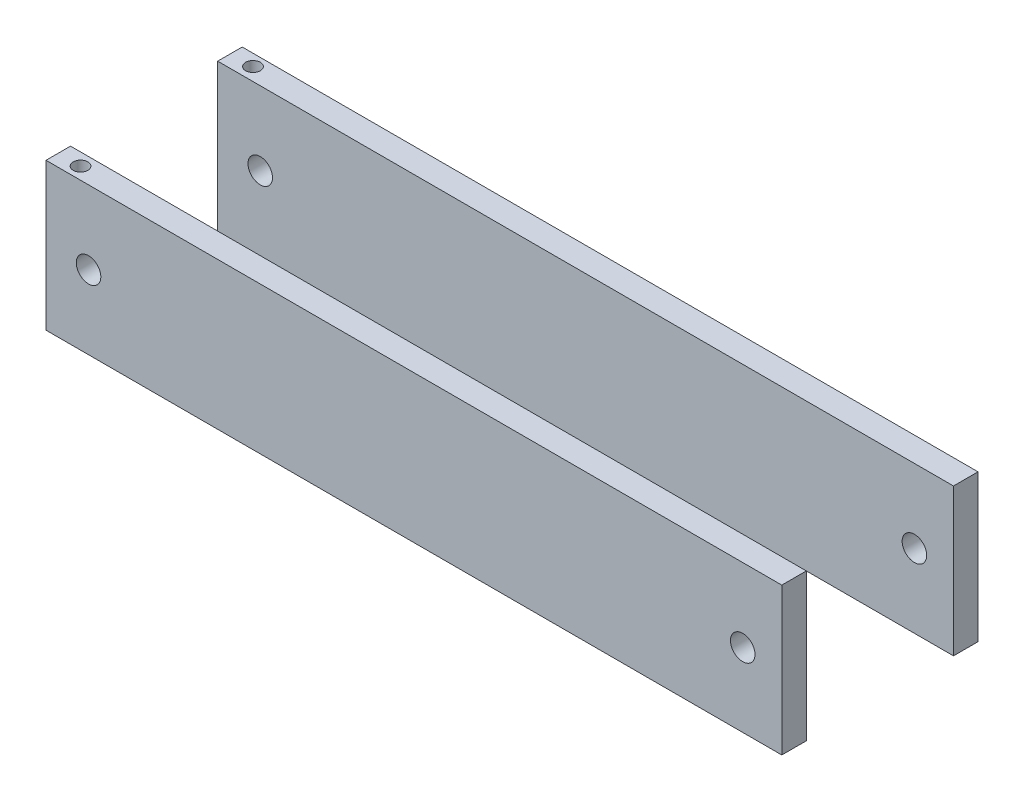
ISO-10303-21;
HEADER;
FILE_DESCRIPTION(('STEP AP214'),'2;1');
FILE_NAME('part.step','',(''),(''),'','','');
FILE_SCHEMA(('AUTOMOTIVE_DESIGN { 1 0 10303 214 1 1 1 1 }'));
ENDSEC;
DATA;
#1=APPLICATION_CONTEXT('core data for automotive mechanical design processes');
#2=APPLICATION_PROTOCOL_DEFINITION('international standard','automotive_design',2000,#1);
#3=PRODUCT_CONTEXT('',#1,'mechanical');
#4=PRODUCT('Part','Part','',(#3));
#5=PRODUCT_RELATED_PRODUCT_CATEGORY('part','',(#4));
#6=PRODUCT_DEFINITION_FORMATION('','',#4);
#7=PRODUCT_DEFINITION_CONTEXT('part definition',#1,'design');
#8=PRODUCT_DEFINITION('design','',#6,#7);
#9=PRODUCT_DEFINITION_SHAPE('','',#8);
#10=(LENGTH_UNIT() NAMED_UNIT(*) SI_UNIT(.MILLI.,.METRE.));
#11=(NAMED_UNIT(*) PLANE_ANGLE_UNIT() SI_UNIT($,.RADIAN.));
#12=(NAMED_UNIT(*) SI_UNIT($,.STERADIAN.) SOLID_ANGLE_UNIT());
#13=UNCERTAINTY_MEASURE_WITH_UNIT(LENGTH_MEASURE(1.E-05),#10,'distance_accuracy_value','');
#14=(GEOMETRIC_REPRESENTATION_CONTEXT(3) GLOBAL_UNCERTAINTY_ASSIGNED_CONTEXT((#13)) GLOBAL_UNIT_ASSIGNED_CONTEXT((#10,
#11,#12)) REPRESENTATION_CONTEXT('',''));
#15=CARTESIAN_POINT('',(0.,0.,0.));
#16=DIRECTION('',(0.,0.,1.));
#17=DIRECTION('',(1.,0.,0.));
#18=AXIS2_PLACEMENT_3D('',#15,#16,#17);
#19=CARTESIAN_POINT('',(-150.,30.,40.));
#20=DIRECTION('',(0.,-1.,0.));
#21=DIRECTION('',(0.,0.,-1.));
#22=AXIS2_PLACEMENT_3D('',#19,#20,#21);
#23=PLANE('',#22);
#24=CARTESIAN_POINT('',(-140.904606352604,30.,35.0126597603438));
#25=DIRECTION('',(0.,1.,0.));
#26=DIRECTION('',(0.,0.,1.));
#27=AXIS2_PLACEMENT_3D('',#24,#25,#26);
#28=CIRCLE('',#27,2.99999999999999);
#29=CARTESIAN_POINT('',(-140.904606352604,30.,38.0126597603438));
#30=VERTEX_POINT('',#29);
#31=EDGE_CURVE('E121',#30,#30,#28,.T.);
#32=ORIENTED_EDGE('',*,*,#31,.F.);
#33=EDGE_LOOP('',(#32));
#34=FACE_BOUND('',#33,.T.);
#35=DIRECTION('',(1.,0.,0.));
#36=VECTOR('',#35,1.);
#37=CARTESIAN_POINT('',(-150.,30.,30.));
#38=LINE('',#37,#36);
#39=CARTESIAN_POINT('',(-150.,30.,30.));
#40=VERTEX_POINT('',#39);
#41=CARTESIAN_POINT('',(150.,30.,30.));
#42=VERTEX_POINT('',#41);
#43=EDGE_CURVE('E56',#40,#42,#38,.T.);
#44=ORIENTED_EDGE('',*,*,#43,.F.);
#45=DIRECTION('',(0.,0.,-1.));
#46=VECTOR('',#45,1.);
#47=CARTESIAN_POINT('',(-150.,30.,40.));
#48=LINE('',#47,#46);
#49=CARTESIAN_POINT('',(-150.,30.,40.));
#50=VERTEX_POINT('',#49);
#51=EDGE_CURVE('E133',#50,#40,#48,.T.);
#52=ORIENTED_EDGE('',*,*,#51,.F.);
#53=DIRECTION('',(-1.,0.,0.));
#54=VECTOR('',#53,1.);
#55=CARTESIAN_POINT('',(-150.,30.,40.));
#56=LINE('',#55,#54);
#57=CARTESIAN_POINT('',(150.,30.,40.));
#58=VERTEX_POINT('',#57);
#59=EDGE_CURVE('E132',#58,#50,#56,.T.);
#60=ORIENTED_EDGE('',*,*,#59,.F.);
#61=DIRECTION('',(0.,0.,-1.));
#62=VECTOR('',#61,1.);
#63=CARTESIAN_POINT('',(150.,30.,40.));
#64=LINE('',#63,#62);
#65=EDGE_CURVE('E111',#58,#42,#64,.T.);
#66=ORIENTED_EDGE('',*,*,#65,.T.);
#67=EDGE_LOOP('',(#44,#52,#60,#66));
#68=FACE_BOUND('',#67,.T.);
#69=ADVANCED_FACE('F47',(#34,#68),#23,.F.);
#70=CARTESIAN_POINT('',(-150.,30.,40.));
#71=DIRECTION('',(1.,0.,0.));
#72=DIRECTION('',(0.,0.,-1.));
#73=AXIS2_PLACEMENT_3D('',#70,#71,#72);
#74=PLANE('',#73);
#75=DIRECTION('',(0.,1.,0.));
#76=VECTOR('',#75,1.);
#77=CARTESIAN_POINT('',(-150.,-30.,30.));
#78=LINE('',#77,#76);
#79=CARTESIAN_POINT('',(-150.,-30.,30.));
#80=VERTEX_POINT('',#79);
#81=EDGE_CURVE('E12',#80,#40,#78,.T.);
#82=ORIENTED_EDGE('',*,*,#81,.F.);
#83=DIRECTION('',(0.,0.,-1.));
#84=VECTOR('',#83,1.);
#85=CARTESIAN_POINT('',(-150.,-30.,40.));
#86=LINE('',#85,#84);
#87=CARTESIAN_POINT('',(-150.,-30.,40.));
#88=VERTEX_POINT('',#87);
#89=EDGE_CURVE('E105',#88,#80,#86,.T.);
#90=ORIENTED_EDGE('',*,*,#89,.F.);
#91=DIRECTION('',(0.,-1.,0.));
#92=VECTOR('',#91,1.);
#93=CARTESIAN_POINT('',(-150.,30.,40.));
#94=LINE('',#93,#92);
#95=EDGE_CURVE('E129',#50,#88,#94,.T.);
#96=ORIENTED_EDGE('',*,*,#95,.F.);
#97=ORIENTED_EDGE('',*,*,#51,.T.);
#98=EDGE_LOOP('',(#82,#90,#96,#97));
#99=FACE_BOUND('',#98,.T.);
#100=ADVANCED_FACE('F138',(#99),#74,.F.);
#101=CARTESIAN_POINT('',(-150.,-30.,40.));
#102=DIRECTION('',(0.,1.,0.));
#103=DIRECTION('',(0.,0.,1.));
#104=AXIS2_PLACEMENT_3D('',#101,#102,#103);
#105=PLANE('',#104);
#106=ORIENTED_EDGE('',*,*,#89,.T.);
#107=DIRECTION('',(1.,0.,0.));
#108=VECTOR('',#107,1.);
#109=CARTESIAN_POINT('',(-150.,-30.,30.));
#110=LINE('',#109,#108);
#111=CARTESIAN_POINT('',(150.,-30.,30.));
#112=VERTEX_POINT('',#111);
#113=EDGE_CURVE('E87',#80,#112,#110,.T.);
#114=ORIENTED_EDGE('',*,*,#113,.T.);
#115=DIRECTION('',(0.,0.,-1.));
#116=VECTOR('',#115,1.);
#117=CARTESIAN_POINT('',(150.,-30.,40.));
#118=LINE('',#117,#116);
#119=CARTESIAN_POINT('',(150.,-30.,40.));
#120=VERTEX_POINT('',#119);
#121=EDGE_CURVE('E91',#120,#112,#118,.T.);
#122=ORIENTED_EDGE('',*,*,#121,.F.);
#123=DIRECTION('',(1.,0.,0.));
#124=VECTOR('',#123,1.);
#125=CARTESIAN_POINT('',(-150.,-30.,40.));
#126=LINE('',#125,#124);
#127=EDGE_CURVE('E130',#88,#120,#126,.T.);
#128=ORIENTED_EDGE('',*,*,#127,.F.);
#129=EDGE_LOOP('',(#106,#114,#122,#128));
#130=FACE_BOUND('',#129,.T.);
#131=ADVANCED_FACE('F98',(#130),#105,.F.);
#132=CARTESIAN_POINT('',(150.,30.,40.));
#133=DIRECTION('',(-1.,0.,0.));
#134=DIRECTION('',(0.,0.,1.));
#135=AXIS2_PLACEMENT_3D('',#132,#133,#134);
#136=PLANE('',#135);
#137=ORIENTED_EDGE('',*,*,#121,.T.);
#138=DIRECTION('',(0.,1.,0.));
#139=VECTOR('',#138,1.);
#140=CARTESIAN_POINT('',(150.,-30.,30.));
#141=LINE('',#140,#139);
#142=EDGE_CURVE('E81',#112,#42,#141,.T.);
#143=ORIENTED_EDGE('',*,*,#142,.T.);
#144=ORIENTED_EDGE('',*,*,#65,.F.);
#145=DIRECTION('',(0.,1.,0.));
#146=VECTOR('',#145,1.);
#147=CARTESIAN_POINT('',(150.,30.,40.));
#148=LINE('',#147,#146);
#149=EDGE_CURVE('E95',#120,#58,#148,.T.);
#150=ORIENTED_EDGE('',*,*,#149,.F.);
#151=EDGE_LOOP('',(#137,#143,#144,#150));
#152=FACE_BOUND('',#151,.T.);
#153=ADVANCED_FACE('F51',(#152),#136,.F.);
#154=CARTESIAN_POINT('',(0.,0.,40.));
#155=DIRECTION('',(0.,0.,1.));
#156=DIRECTION('',(1.,0.,0.));
#157=AXIS2_PLACEMENT_3D('',#154,#155,#156);
#158=PLANE('',#157);
#159=CARTESIAN_POINT('',(134.072867862781,0.,40.));
#160=DIRECTION('',(0.,0.,-1.));
#161=DIRECTION('',(-1.,0.,0.));
#162=AXIS2_PLACEMENT_3D('',#159,#160,#161);
#163=CIRCLE('',#162,5.00000000000002);
#164=CARTESIAN_POINT('',(129.072867862781,0.,40.));
#165=VERTEX_POINT('',#164);
#166=EDGE_CURVE('E109',#165,#165,#163,.T.);
#167=ORIENTED_EDGE('',*,*,#166,.T.);
#168=EDGE_LOOP('',(#167));
#169=FACE_BOUND('',#168,.T.);
#170=CARTESIAN_POINT('',(-132.649589010734,0.,40.));
#171=DIRECTION('',(0.,0.,-1.));
#172=DIRECTION('',(-1.,0.,0.));
#173=AXIS2_PLACEMENT_3D('',#170,#171,#172);
#174=CIRCLE('',#173,4.99999999999999);
#175=CARTESIAN_POINT('',(-137.649589010734,0.,40.));
#176=VERTEX_POINT('',#175);
#177=EDGE_CURVE('E117',#176,#176,#174,.T.);
#178=ORIENTED_EDGE('',*,*,#177,.T.);
#179=EDGE_LOOP('',(#178));
#180=FACE_BOUND('',#179,.T.);
#181=ORIENTED_EDGE('',*,*,#149,.T.);
#182=ORIENTED_EDGE('',*,*,#59,.T.);
#183=ORIENTED_EDGE('',*,*,#95,.T.);
#184=ORIENTED_EDGE('',*,*,#127,.T.);
#185=EDGE_LOOP('',(#181,#182,#183,#184));
#186=FACE_BOUND('',#185,.T.);
#187=ADVANCED_FACE('F141',(#169,#180,#186),#158,.T.);
#188=CARTESIAN_POINT('',(-150.,-30.,30.));
#189=DIRECTION('',(0.,0.,1.));
#190=DIRECTION('',(1.,0.,0.));
#191=AXIS2_PLACEMENT_3D('',#188,#189,#190);
#192=PLANE('',#191);
#193=CARTESIAN_POINT('',(134.072867862781,0.,30.));
#194=DIRECTION('',(0.,0.,1.));
#195=DIRECTION('',(1.,0.,0.));
#196=AXIS2_PLACEMENT_3D('',#193,#194,#195);
#197=CIRCLE('',#196,5.00000000000002);
#198=CARTESIAN_POINT('',(139.072867862781,0.,30.));
#199=VERTEX_POINT('',#198);
#200=EDGE_CURVE('E52',#199,#199,#197,.T.);
#201=ORIENTED_EDGE('',*,*,#200,.T.);
#202=EDGE_LOOP('',(#201));
#203=FACE_BOUND('',#202,.T.);
#204=CARTESIAN_POINT('',(-132.649589010734,0.,30.));
#205=DIRECTION('',(0.,0.,1.));
#206=DIRECTION('',(1.,0.,0.));
#207=AXIS2_PLACEMENT_3D('',#204,#205,#206);
#208=CIRCLE('',#207,4.99999999999999);
#209=CARTESIAN_POINT('',(-127.649589010734,0.,30.));
#210=VERTEX_POINT('',#209);
#211=EDGE_CURVE('E107',#210,#210,#208,.T.);
#212=ORIENTED_EDGE('',*,*,#211,.T.);
#213=EDGE_LOOP('',(#212));
#214=FACE_BOUND('',#213,.T.);
#215=ORIENTED_EDGE('',*,*,#43,.T.);
#216=ORIENTED_EDGE('',*,*,#142,.F.);
#217=ORIENTED_EDGE('',*,*,#113,.F.);
#218=ORIENTED_EDGE('',*,*,#81,.T.);
#219=EDGE_LOOP('',(#215,#216,#217,#218));
#220=FACE_BOUND('',#219,.T.);
#221=ADVANCED_FACE('F88',(#203,#214,#220),#192,.F.);
#222=CARTESIAN_POINT('',(-132.649589010734,0.,40.));
#223=DIRECTION('',(0.,0.,-1.));
#224=DIRECTION('',(-1.,0.,0.));
#225=AXIS2_PLACEMENT_3D('',#222,#223,#224);
#226=CYLINDRICAL_SURFACE('',#225,4.99999999999999);
#227=ORIENTED_EDGE('',*,*,#177,.F.);
#228=EDGE_LOOP('',(#227));
#229=FACE_BOUND('',#228,.T.);
#230=ORIENTED_EDGE('',*,*,#211,.F.);
#231=EDGE_LOOP('',(#230));
#232=FACE_BOUND('',#231,.T.);
#233=ADVANCED_FACE('F147',(#229,#232),#226,.F.);
#234=CARTESIAN_POINT('',(134.072867862781,0.,40.));
#235=DIRECTION('',(0.,0.,-1.));
#236=DIRECTION('',(-1.,0.,0.));
#237=AXIS2_PLACEMENT_3D('',#234,#235,#236);
#238=CYLINDRICAL_SURFACE('',#237,5.00000000000002);
#239=ORIENTED_EDGE('',*,*,#166,.F.);
#240=EDGE_LOOP('',(#239));
#241=FACE_BOUND('',#240,.T.);
#242=ORIENTED_EDGE('',*,*,#200,.F.);
#243=EDGE_LOOP('',(#242));
#244=FACE_BOUND('',#243,.T.);
#245=ADVANCED_FACE('F197',(#241,#244),#238,.F.);
#246=CARTESIAN_POINT('',(-140.904606352604,20.,35.0126597603438));
#247=DIRECTION('',(0.,1.,0.));
#248=DIRECTION('',(0.,0.,1.));
#249=AXIS2_PLACEMENT_3D('',#246,#247,#248);
#250=CYLINDRICAL_SURFACE('',#249,2.99999999999999);
#251=CARTESIAN_POINT('',(-140.904606352604,20.,35.0126597603438));
#252=DIRECTION('',(0.,1.,0.));
#253=DIRECTION('',(0.,0.,1.));
#254=AXIS2_PLACEMENT_3D('',#251,#252,#253);
#255=CIRCLE('',#254,2.99999999999999);
#256=CARTESIAN_POINT('',(-140.904606352604,20.,38.0126597603438));
#257=VERTEX_POINT('',#256);
#258=EDGE_CURVE('E122',#257,#257,#255,.T.);
#259=ORIENTED_EDGE('',*,*,#258,.F.);
#260=EDGE_LOOP('',(#259));
#261=FACE_BOUND('',#260,.T.);
#262=ORIENTED_EDGE('',*,*,#31,.T.);
#263=EDGE_LOOP('',(#262));
#264=FACE_BOUND('',#263,.T.);
#265=ADVANCED_FACE('F202',(#261,#264),#250,.F.);
#266=CARTESIAN_POINT('',(-140.904606352604,20.,35.0126597603438));
#267=DIRECTION('',(0.,1.,0.));
#268=DIRECTION('',(0.,0.,1.));
#269=AXIS2_PLACEMENT_3D('',#266,#267,#268);
#270=PLANE('',#269);
#271=ORIENTED_EDGE('',*,*,#258,.T.);
#272=EDGE_LOOP('',(#271));
#273=FACE_BOUND('',#272,.T.);
#274=ADVANCED_FACE('F212',(#273),#270,.T.);
#275=CLOSED_SHELL('',(#69,#100,#131,#153,#187,#221,#233,#245,#265,#274));
#276=MANIFOLD_SOLID_BREP('B2',#275);
#277=CARTESIAN_POINT('',(0.,0.,-40.));
#278=DIRECTION('',(0.,0.,1.));
#279=DIRECTION('',(1.,0.,0.));
#280=AXIS2_PLACEMENT_3D('',#277,#278,#279);
#281=PLANE('',#280);
#282=CARTESIAN_POINT('',(134.072867862781,0.,-40.));
#283=DIRECTION('',(0.,0.,-1.));
#284=DIRECTION('',(-1.,0.,0.));
#285=AXIS2_PLACEMENT_3D('',#282,#283,#284);
#286=CIRCLE('',#285,5.00000000000002);
#287=CARTESIAN_POINT('',(129.072867862781,0.,-40.));
#288=VERTEX_POINT('',#287);
#289=EDGE_CURVE('E310',#288,#288,#286,.T.);
#290=ORIENTED_EDGE('',*,*,#289,.F.);
#291=EDGE_LOOP('',(#290));
#292=FACE_BOUND('',#291,.T.);
#293=CARTESIAN_POINT('',(-132.649589010734,0.,-40.));
#294=DIRECTION('',(0.,0.,-1.));
#295=DIRECTION('',(-1.,0.,0.));
#296=AXIS2_PLACEMENT_3D('',#293,#294,#295);
#297=CIRCLE('',#296,4.99999999999999);
#298=CARTESIAN_POINT('',(-137.649589010734,0.,-40.));
#299=VERTEX_POINT('',#298);
#300=EDGE_CURVE('E314',#299,#299,#297,.T.);
#301=ORIENTED_EDGE('',*,*,#300,.F.);
#302=EDGE_LOOP('',(#301));
#303=FACE_BOUND('',#302,.T.);
#304=DIRECTION('',(0.,1.,0.));
#305=VECTOR('',#304,1.);
#306=CARTESIAN_POINT('',(150.,30.,-40.));
#307=LINE('',#306,#305);
#308=CARTESIAN_POINT('',(150.,-30.,-40.));
#309=VERTEX_POINT('',#308);
#310=CARTESIAN_POINT('',(150.,30.,-40.));
#311=VERTEX_POINT('',#310);
#312=EDGE_CURVE('E326',#309,#311,#307,.T.);
#313=ORIENTED_EDGE('',*,*,#312,.F.);
#314=DIRECTION('',(1.,0.,0.));
#315=VECTOR('',#314,1.);
#316=CARTESIAN_POINT('',(-150.,-30.,-40.));
#317=LINE('',#316,#315);
#318=CARTESIAN_POINT('',(-150.,-30.,-40.));
#319=VERTEX_POINT('',#318);
#320=EDGE_CURVE('E299',#319,#309,#317,.T.);
#321=ORIENTED_EDGE('',*,*,#320,.F.);
#322=DIRECTION('',(0.,-1.,0.));
#323=VECTOR('',#322,1.);
#324=CARTESIAN_POINT('',(-150.,30.,-40.));
#325=LINE('',#324,#323);
#326=CARTESIAN_POINT('',(-150.,30.,-40.));
#327=VERTEX_POINT('',#326);
#328=EDGE_CURVE('E305',#327,#319,#325,.T.);
#329=ORIENTED_EDGE('',*,*,#328,.F.);
#330=DIRECTION('',(-1.,0.,0.));
#331=VECTOR('',#330,1.);
#332=CARTESIAN_POINT('',(-150.,30.,-40.));
#333=LINE('',#332,#331);
#334=EDGE_CURVE('E328',#311,#327,#333,.T.);
#335=ORIENTED_EDGE('',*,*,#334,.F.);
#336=EDGE_LOOP('',(#313,#321,#329,#335));
#337=FACE_BOUND('',#336,.T.);
#338=ADVANCED_FACE('F243',(#292,#303,#337),#281,.F.);
#339=CARTESIAN_POINT('',(-150.,-30.,40.));
#340=DIRECTION('',(0.,1.,0.));
#341=DIRECTION('',(0.,0.,1.));
#342=AXIS2_PLACEMENT_3D('',#339,#340,#341);
#343=PLANE('',#342);
#344=DIRECTION('',(0.,0.,-1.));
#345=VECTOR('',#344,1.);
#346=CARTESIAN_POINT('',(150.,-30.,40.));
#347=LINE('',#346,#345);
#348=CARTESIAN_POINT('',(150.,-30.,-30.));
#349=VERTEX_POINT('',#348);
#350=EDGE_CURVE('E269',#349,#309,#347,.T.);
#351=ORIENTED_EDGE('',*,*,#350,.F.);
#352=DIRECTION('',(-1.,0.,0.));
#353=VECTOR('',#352,1.);
#354=CARTESIAN_POINT('',(-150.,-30.,-30.));
#355=LINE('',#354,#353);
#356=CARTESIAN_POINT('',(-150.,-30.,-30.));
#357=VERTEX_POINT('',#356);
#358=EDGE_CURVE('E287',#349,#357,#355,.T.);
#359=ORIENTED_EDGE('',*,*,#358,.T.);
#360=DIRECTION('',(0.,0.,-1.));
#361=VECTOR('',#360,1.);
#362=CARTESIAN_POINT('',(-150.,-30.,40.));
#363=LINE('',#362,#361);
#364=EDGE_CURVE('E298',#357,#319,#363,.T.);
#365=ORIENTED_EDGE('',*,*,#364,.T.);
#366=ORIENTED_EDGE('',*,*,#320,.T.);
#367=EDGE_LOOP('',(#351,#359,#365,#366));
#368=FACE_BOUND('',#367,.T.);
#369=ADVANCED_FACE('F297',(#368),#343,.F.);
#370=CARTESIAN_POINT('',(-150.,30.,40.));
#371=DIRECTION('',(1.,0.,0.));
#372=DIRECTION('',(0.,0.,-1.));
#373=AXIS2_PLACEMENT_3D('',#370,#371,#372);
#374=PLANE('',#373);
#375=ORIENTED_EDGE('',*,*,#364,.F.);
#376=DIRECTION('',(0.,1.,0.));
#377=VECTOR('',#376,1.);
#378=CARTESIAN_POINT('',(-150.,-30.,-30.));
#379=LINE('',#378,#377);
#380=CARTESIAN_POINT('',(-150.,30.,-30.));
#381=VERTEX_POINT('',#380);
#382=EDGE_CURVE('E265',#357,#381,#379,.T.);
#383=ORIENTED_EDGE('',*,*,#382,.T.);
#384=DIRECTION('',(0.,0.,-1.));
#385=VECTOR('',#384,1.);
#386=CARTESIAN_POINT('',(-150.,30.,40.));
#387=LINE('',#386,#385);
#388=EDGE_CURVE('E255',#381,#327,#387,.T.);
#389=ORIENTED_EDGE('',*,*,#388,.T.);
#390=ORIENTED_EDGE('',*,*,#328,.T.);
#391=EDGE_LOOP('',(#375,#383,#389,#390));
#392=FACE_BOUND('',#391,.T.);
#393=ADVANCED_FACE('F331',(#392),#374,.F.);
#394=CARTESIAN_POINT('',(-150.,30.,40.));
#395=DIRECTION('',(0.,-1.,0.));
#396=DIRECTION('',(0.,0.,-1.));
#397=AXIS2_PLACEMENT_3D('',#394,#395,#396);
#398=PLANE('',#397);
#399=CARTESIAN_POINT('',(-140.904606352604,30.,-35.2973155307536));
#400=DIRECTION('',(0.,1.,0.));
#401=DIRECTION('',(0.,0.,1.));
#402=AXIS2_PLACEMENT_3D('',#399,#400,#401);
#403=CIRCLE('',#402,2.99999999999999);
#404=CARTESIAN_POINT('',(-140.904606352604,30.,-32.2973155307536));
#405=VERTEX_POINT('',#404);
#406=EDGE_CURVE('E317',#405,#405,#403,.T.);
#407=ORIENTED_EDGE('',*,*,#406,.F.);
#408=EDGE_LOOP('',(#407));
#409=FACE_BOUND('',#408,.T.);
#410=DIRECTION('',(-1.,0.,0.));
#411=VECTOR('',#410,1.);
#412=CARTESIAN_POINT('',(-150.,30.,-30.));
#413=LINE('',#412,#411);
#414=CARTESIAN_POINT('',(150.,30.,-30.));
#415=VERTEX_POINT('',#414);
#416=EDGE_CURVE('E295',#415,#381,#413,.T.);
#417=ORIENTED_EDGE('',*,*,#416,.F.);
#418=DIRECTION('',(0.,0.,-1.));
#419=VECTOR('',#418,1.);
#420=CARTESIAN_POINT('',(150.,30.,40.));
#421=LINE('',#420,#419);
#422=EDGE_CURVE('E50',#415,#311,#421,.T.);
#423=ORIENTED_EDGE('',*,*,#422,.T.);
#424=ORIENTED_EDGE('',*,*,#334,.T.);
#425=ORIENTED_EDGE('',*,*,#388,.F.);
#426=EDGE_LOOP('',(#417,#423,#424,#425));
#427=FACE_BOUND('',#426,.T.);
#428=ADVANCED_FACE('F336',(#409,#427),#398,.F.);
#429=CARTESIAN_POINT('',(150.,30.,40.));
#430=DIRECTION('',(-1.,0.,0.));
#431=DIRECTION('',(0.,0.,1.));
#432=AXIS2_PLACEMENT_3D('',#429,#430,#431);
#433=PLANE('',#432);
#434=DIRECTION('',(0.,1.,0.));
#435=VECTOR('',#434,1.);
#436=CARTESIAN_POINT('',(150.,-30.,-30.));
#437=LINE('',#436,#435);
#438=EDGE_CURVE('E290',#349,#415,#437,.T.);
#439=ORIENTED_EDGE('',*,*,#438,.F.);
#440=ORIENTED_EDGE('',*,*,#350,.T.);
#441=ORIENTED_EDGE('',*,*,#312,.T.);
#442=ORIENTED_EDGE('',*,*,#422,.F.);
#443=EDGE_LOOP('',(#439,#440,#441,#442));
#444=FACE_BOUND('',#443,.T.);
#445=ADVANCED_FACE('F249',(#444),#433,.F.);
#446=CARTESIAN_POINT('',(-150.,-30.,-30.));
#447=DIRECTION('',(0.,0.,-1.));
#448=DIRECTION('',(-1.,0.,0.));
#449=AXIS2_PLACEMENT_3D('',#446,#447,#448);
#450=PLANE('',#449);
#451=CARTESIAN_POINT('',(134.072867862781,0.,-30.));
#452=DIRECTION('',(0.,0.,-1.));
#453=DIRECTION('',(-1.,0.,0.));
#454=AXIS2_PLACEMENT_3D('',#451,#452,#453);
#455=CIRCLE('',#454,5.00000000000002);
#456=CARTESIAN_POINT('',(129.072867862781,0.,-30.));
#457=VERTEX_POINT('',#456);
#458=EDGE_CURVE('E246',#457,#457,#455,.T.);
#459=ORIENTED_EDGE('',*,*,#458,.T.);
#460=EDGE_LOOP('',(#459));
#461=FACE_BOUND('',#460,.T.);
#462=CARTESIAN_POINT('',(-132.649589010734,0.,-30.));
#463=DIRECTION('',(0.,0.,-1.));
#464=DIRECTION('',(-1.,0.,0.));
#465=AXIS2_PLACEMENT_3D('',#462,#463,#464);
#466=CIRCLE('',#465,4.99999999999999);
#467=CARTESIAN_POINT('',(-137.649589010734,0.,-30.));
#468=VERTEX_POINT('',#467);
#469=EDGE_CURVE('E307',#468,#468,#466,.T.);
#470=ORIENTED_EDGE('',*,*,#469,.T.);
#471=EDGE_LOOP('',(#470));
#472=FACE_BOUND('',#471,.T.);
#473=ORIENTED_EDGE('',*,*,#416,.T.);
#474=ORIENTED_EDGE('',*,*,#382,.F.);
#475=ORIENTED_EDGE('',*,*,#358,.F.);
#476=ORIENTED_EDGE('',*,*,#438,.T.);
#477=EDGE_LOOP('',(#473,#474,#475,#476));
#478=FACE_BOUND('',#477,.T.);
#479=ADVANCED_FACE('F289',(#461,#472,#478),#450,.F.);
#480=CARTESIAN_POINT('',(-132.649589010734,0.,40.));
#481=DIRECTION('',(0.,0.,-1.));
#482=DIRECTION('',(-1.,0.,0.));
#483=AXIS2_PLACEMENT_3D('',#480,#481,#482);
#484=CYLINDRICAL_SURFACE('',#483,4.99999999999999);
#485=ORIENTED_EDGE('',*,*,#300,.T.);
#486=EDGE_LOOP('',(#485));
#487=FACE_BOUND('',#486,.T.);
#488=ORIENTED_EDGE('',*,*,#469,.F.);
#489=EDGE_LOOP('',(#488));
#490=FACE_BOUND('',#489,.T.);
#491=ADVANCED_FACE('F363',(#487,#490),#484,.F.);
#492=CARTESIAN_POINT('',(134.072867862781,0.,40.));
#493=DIRECTION('',(0.,0.,-1.));
#494=DIRECTION('',(-1.,0.,0.));
#495=AXIS2_PLACEMENT_3D('',#492,#493,#494);
#496=CYLINDRICAL_SURFACE('',#495,5.00000000000002);
#497=ORIENTED_EDGE('',*,*,#289,.T.);
#498=EDGE_LOOP('',(#497));
#499=FACE_BOUND('',#498,.T.);
#500=ORIENTED_EDGE('',*,*,#458,.F.);
#501=EDGE_LOOP('',(#500));
#502=FACE_BOUND('',#501,.T.);
#503=ADVANCED_FACE('F364',(#499,#502),#496,.F.);
#504=CARTESIAN_POINT('',(-140.904606352604,20.,-35.2973155307536));
#505=DIRECTION('',(0.,1.,0.));
#506=DIRECTION('',(0.,0.,1.));
#507=AXIS2_PLACEMENT_3D('',#504,#505,#506);
#508=CYLINDRICAL_SURFACE('',#507,2.99999999999999);
#509=CARTESIAN_POINT('',(-140.904606352604,20.,-35.2973155307536));
#510=DIRECTION('',(0.,1.,0.));
#511=DIRECTION('',(0.,0.,1.));
#512=AXIS2_PLACEMENT_3D('',#509,#510,#511);
#513=CIRCLE('',#512,2.99999999999999);
#514=CARTESIAN_POINT('',(-140.904606352604,20.,-32.2973155307536));
#515=VERTEX_POINT('',#514);
#516=EDGE_CURVE('E325',#515,#515,#513,.T.);
#517=ORIENTED_EDGE('',*,*,#516,.F.);
#518=EDGE_LOOP('',(#517));
#519=FACE_BOUND('',#518,.T.);
#520=ORIENTED_EDGE('',*,*,#406,.T.);
#521=EDGE_LOOP('',(#520));
#522=FACE_BOUND('',#521,.T.);
#523=ADVANCED_FACE('F366',(#519,#522),#508,.F.);
#524=CARTESIAN_POINT('',(-140.904606352604,20.,-35.2973155307536));
#525=DIRECTION('',(0.,1.,0.));
#526=DIRECTION('',(0.,0.,1.));
#527=AXIS2_PLACEMENT_3D('',#524,#525,#526);
#528=PLANE('',#527);
#529=ORIENTED_EDGE('',*,*,#516,.T.);
#530=EDGE_LOOP('',(#529));
#531=FACE_BOUND('',#530,.T.);
#532=ADVANCED_FACE('F369',(#531),#528,.T.);
#533=CLOSED_SHELL('',(#338,#369,#393,#428,#445,#479,#491,#503,#523,#532));
#534=MANIFOLD_SOLID_BREP('B6',#533);
#535=ADVANCED_BREP_SHAPE_REPRESENTATION('',(#18,#276,#534),#14);
#536=SHAPE_DEFINITION_REPRESENTATION(#9,#535);
ENDSEC;
END-ISO-10303-21;
